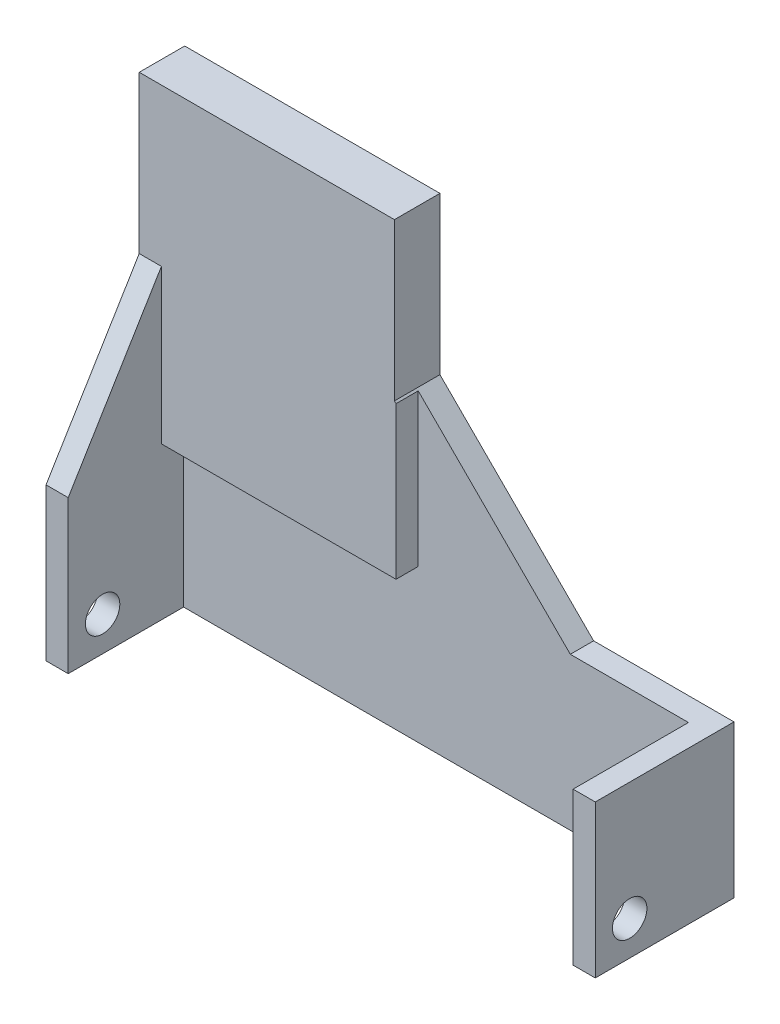
ISO-10303-21;
HEADER;
FILE_DESCRIPTION(('STEP AP214'),'2;1');
FILE_NAME('part.step','',(''),(''),'','','');
FILE_SCHEMA(('AUTOMOTIVE_DESIGN { 1 0 10303 214 1 1 1 1 }'));
ENDSEC;
DATA;
#1=APPLICATION_CONTEXT('core data for automotive mechanical design processes');
#2=APPLICATION_PROTOCOL_DEFINITION('international standard','automotive_design',2000,#1);
#3=PRODUCT_CONTEXT('',#1,'mechanical');
#4=PRODUCT('Part','Part','',(#3));
#5=PRODUCT_RELATED_PRODUCT_CATEGORY('part','',(#4));
#6=PRODUCT_DEFINITION_FORMATION('','',#4);
#7=PRODUCT_DEFINITION_CONTEXT('part definition',#1,'design');
#8=PRODUCT_DEFINITION('design','',#6,#7);
#9=PRODUCT_DEFINITION_SHAPE('','',#8);
#10=(LENGTH_UNIT() NAMED_UNIT(*) SI_UNIT(.MILLI.,.METRE.));
#11=(NAMED_UNIT(*) PLANE_ANGLE_UNIT() SI_UNIT($,.RADIAN.));
#12=(NAMED_UNIT(*) SI_UNIT($,.STERADIAN.) SOLID_ANGLE_UNIT());
#13=UNCERTAINTY_MEASURE_WITH_UNIT(LENGTH_MEASURE(1.E-05),#10,'distance_accuracy_value','');
#14=(GEOMETRIC_REPRESENTATION_CONTEXT(3) GLOBAL_UNCERTAINTY_ASSIGNED_CONTEXT((#13)) GLOBAL_UNIT_ASSIGNED_CONTEXT((#10,
#11,#12)) REPRESENTATION_CONTEXT('',''));
#15=CARTESIAN_POINT('',(0.,0.,0.));
#16=DIRECTION('',(0.,0.,1.));
#17=DIRECTION('',(1.,0.,0.));
#18=AXIS2_PLACEMENT_3D('',#15,#16,#17);
#19=CARTESIAN_POINT('',(-2.,41.74,0.));
#20=DIRECTION('',(0.,0.,-1.));
#21=DIRECTION('',(-1.,0.,0.));
#22=AXIS2_PLACEMENT_3D('',#19,#20,#21);
#23=PLANE('',#22);
#24=DIRECTION('',(0.,-1.,0.));
#25=VECTOR('',#24,1.);
#26=CARTESIAN_POINT('',(0.,41.74,0.));
#27=LINE('',#26,#25);
#28=CARTESIAN_POINT('',(0.,13.74,0.));
#29=VERTEX_POINT('',#28);
#30=CARTESIAN_POINT('',(0.,0.,0.));
#31=VERTEX_POINT('',#30);
#32=EDGE_CURVE('E46',#29,#31,#27,.T.);
#33=ORIENTED_EDGE('',*,*,#32,.F.);
#34=DIRECTION('',(-1.,0.,0.));
#35=VECTOR('',#34,1.);
#36=CARTESIAN_POINT('',(47.5,13.74,0.));
#37=LINE('',#36,#35);
#38=CARTESIAN_POINT('',(-2.,13.74,0.));
#39=VERTEX_POINT('',#38);
#40=EDGE_CURVE('E262',#29,#39,#37,.T.);
#41=ORIENTED_EDGE('',*,*,#40,.T.);
#42=DIRECTION('',(0.,-1.,0.));
#43=VECTOR('',#42,1.);
#44=CARTESIAN_POINT('',(-2.,41.74,0.));
#45=LINE('',#44,#43);
#46=CARTESIAN_POINT('',(-2.,0.,0.));
#47=VERTEX_POINT('',#46);
#48=EDGE_CURVE('E107',#39,#47,#45,.T.);
#49=ORIENTED_EDGE('',*,*,#48,.T.);
#50=DIRECTION('',(1.,0.,0.));
#51=VECTOR('',#50,1.);
#52=CARTESIAN_POINT('',(-2.,0.,0.));
#53=LINE('',#52,#51);
#54=EDGE_CURVE('E113',#47,#31,#53,.T.);
#55=ORIENTED_EDGE('',*,*,#54,.T.);
#56=EDGE_LOOP('',(#33,#41,#49,#55));
#57=FACE_BOUND('',#56,.T.);
#58=ADVANCED_FACE('F39',(#57),#23,.F.);
#59=CARTESIAN_POINT('',(0.,41.74,0.));
#60=DIRECTION('',(-1.,0.,0.));
#61=DIRECTION('',(0.,0.,1.));
#62=AXIS2_PLACEMENT_3D('',#59,#60,#61);
#63=PLANE('',#62);
#64=CARTESIAN_POINT('',(0.,3.1,-3.1));
#65=DIRECTION('',(-1.,0.,0.));
#66=DIRECTION('',(0.,0.,1.));
#67=AXIS2_PLACEMENT_3D('',#64,#65,#66);
#68=CIRCLE('',#67,1.55);
#69=CARTESIAN_POINT('',(0.,3.1,-1.55));
#70=VERTEX_POINT('',#69);
#71=EDGE_CURVE('E147',#70,#70,#68,.T.);
#72=ORIENTED_EDGE('',*,*,#71,.T.);
#73=EDGE_LOOP('',(#72));
#74=FACE_BOUND('',#73,.T.);
#75=DIRECTION('',(0.,-1.,0.));
#76=VECTOR('',#75,1.);
#77=CARTESIAN_POINT('',(0.,41.74,-8.4));
#78=LINE('',#77,#76);
#79=CARTESIAN_POINT('',(0.,27.59,-8.4));
#80=VERTEX_POINT('',#79);
#81=CARTESIAN_POINT('',(0.,13.74,-8.4));
#82=VERTEX_POINT('',#81);
#83=EDGE_CURVE('E126',#80,#82,#78,.T.);
#84=ORIENTED_EDGE('',*,*,#83,.F.);
#85=DIRECTION('',(0.,-0.8550319445017,0.518575330961319));
#86=VECTOR('',#85,1.);
#87=CARTESIAN_POINT('',(0.,34.210229531314,-12.4151572608691));
#88=LINE('',#87,#86);
#89=EDGE_CURVE('E139',#80,#29,#88,.T.);
#90=ORIENTED_EDGE('',*,*,#89,.T.);
#91=ORIENTED_EDGE('',*,*,#32,.T.);
#92=DIRECTION('',(0.,0.,-1.));
#93=VECTOR('',#92,1.);
#94=CARTESIAN_POINT('',(0.,0.,0.));
#95=LINE('',#94,#93);
#96=CARTESIAN_POINT('',(0.,0.,-10.4));
#97=VERTEX_POINT('',#96);
#98=EDGE_CURVE('E136',#31,#97,#95,.T.);
#99=ORIENTED_EDGE('',*,*,#98,.T.);
#100=DIRECTION('',(0.,-1.,0.));
#101=VECTOR('',#100,1.);
#102=CARTESIAN_POINT('',(0.,0.,-10.4));
#103=LINE('',#102,#101);
#104=CARTESIAN_POINT('',(0.,13.74,-10.4));
#105=VERTEX_POINT('',#104);
#106=EDGE_CURVE('E185',#105,#97,#103,.T.);
#107=ORIENTED_EDGE('',*,*,#106,.F.);
#108=DIRECTION('',(0.,0.,1.));
#109=VECTOR('',#108,1.);
#110=CARTESIAN_POINT('',(0.,13.74,-10.4));
#111=LINE('',#110,#109);
#112=EDGE_CURVE('E207',#105,#82,#111,.T.);
#113=ORIENTED_EDGE('',*,*,#112,.T.);
#114=EDGE_LOOP('',(#84,#90,#91,#99,#107,#113));
#115=FACE_BOUND('',#114,.T.);
#116=ADVANCED_FACE('F133',(#74,#115),#63,.F.);
#117=CARTESIAN_POINT('',(0.,41.74,-8.4));
#118=DIRECTION('',(0.,0.,-1.));
#119=DIRECTION('',(-1.,0.,0.));
#120=AXIS2_PLACEMENT_3D('',#117,#118,#119);
#121=PLANE('',#120);
#122=DIRECTION('',(-1.,0.,0.));
#123=VECTOR('',#122,1.);
#124=CARTESIAN_POINT('',(0.,13.74,-8.4));
#125=LINE('',#124,#123);
#126=CARTESIAN_POINT('',(21.1427104974823,13.74,-8.4));
#127=VERTEX_POINT('',#126);
#128=EDGE_CURVE('E199',#127,#82,#125,.T.);
#129=ORIENTED_EDGE('',*,*,#128,.F.);
#130=DIRECTION('',(0.,-1.,0.));
#131=VECTOR('',#130,1.);
#132=CARTESIAN_POINT('',(21.1427104974823,13.74,-8.4));
#133=LINE('',#132,#131);
#134=CARTESIAN_POINT('',(21.1427104974823,27.4472895025177,-8.4));
#135=VERTEX_POINT('',#134);
#136=EDGE_CURVE('E196',#135,#127,#133,.T.);
#137=ORIENTED_EDGE('',*,*,#136,.F.);
#138=DIRECTION('',(-0.707106781186546,0.707106781186549,0.));
#139=VECTOR('',#138,1.);
#140=CARTESIAN_POINT('',(3.42500000000005,45.165,-8.4));
#141=LINE('',#140,#139);
#142=CARTESIAN_POINT('',(21.,27.59,-8.4));
#143=VERTEX_POINT('',#142);
#144=EDGE_CURVE('E251',#135,#143,#141,.T.);
#145=ORIENTED_EDGE('',*,*,#144,.T.);
#146=DIRECTION('',(0.,1.,0.));
#147=VECTOR('',#146,1.);
#148=CARTESIAN_POINT('',(21.,41.74,-8.4));
#149=LINE('',#148,#147);
#150=CARTESIAN_POINT('',(21.,41.74,-8.4));
#151=VERTEX_POINT('',#150);
#152=EDGE_CURVE('E248',#143,#151,#149,.T.);
#153=ORIENTED_EDGE('',*,*,#152,.T.);
#154=DIRECTION('',(1.,0.,0.));
#155=VECTOR('',#154,1.);
#156=CARTESIAN_POINT('',(0.,41.74,-8.4));
#157=LINE('',#156,#155);
#158=CARTESIAN_POINT('',(-2.,41.74,-8.4));
#159=VERTEX_POINT('',#158);
#160=EDGE_CURVE('E114',#159,#151,#157,.T.);
#161=ORIENTED_EDGE('',*,*,#160,.F.);
#162=DIRECTION('',(0.,-1.,0.));
#163=VECTOR('',#162,1.);
#164=CARTESIAN_POINT('',(-2.,41.74,-8.4));
#165=LINE('',#164,#163);
#166=CARTESIAN_POINT('',(-2.,27.59,-8.4));
#167=VERTEX_POINT('',#166);
#168=EDGE_CURVE('E254',#159,#167,#165,.T.);
#169=ORIENTED_EDGE('',*,*,#168,.T.);
#170=DIRECTION('',(-1.,0.,0.));
#171=VECTOR('',#170,1.);
#172=CARTESIAN_POINT('',(47.5,27.59,-8.4));
#173=LINE('',#172,#171);
#174=EDGE_CURVE('E260',#80,#167,#173,.T.);
#175=ORIENTED_EDGE('',*,*,#174,.F.);
#176=ORIENTED_EDGE('',*,*,#83,.T.);
#177=EDGE_LOOP('',(#129,#137,#145,#153,#161,#169,#175,#176));
#178=FACE_BOUND('',#177,.T.);
#179=ADVANCED_FACE('F295',(#178),#121,.F.);
#180=CARTESIAN_POINT('',(45.5,41.74,-8.4));
#181=DIRECTION('',(1.,0.,0.));
#182=DIRECTION('',(0.,0.,-1.));
#183=AXIS2_PLACEMENT_3D('',#180,#181,#182);
#184=PLANE('',#183);
#185=CARTESIAN_POINT('',(45.5,3.1,-3.1));
#186=DIRECTION('',(1.,0.,0.));
#187=DIRECTION('',(0.,0.,-1.));
#188=AXIS2_PLACEMENT_3D('',#185,#186,#187);
#189=CIRCLE('',#188,1.55);
#190=CARTESIAN_POINT('',(45.5,3.1,-4.65));
#191=VERTEX_POINT('',#190);
#192=EDGE_CURVE('E150',#191,#191,#189,.T.);
#193=ORIENTED_EDGE('',*,*,#192,.T.);
#194=EDGE_LOOP('',(#193));
#195=FACE_BOUND('',#194,.T.);
#196=DIRECTION('',(0.,-1.,0.));
#197=VECTOR('',#196,1.);
#198=CARTESIAN_POINT('',(45.5,41.74,0.));
#199=LINE('',#198,#197);
#200=CARTESIAN_POINT('',(45.5,13.74,0.));
#201=VERTEX_POINT('',#200);
#202=CARTESIAN_POINT('',(45.5,0.,0.));
#203=VERTEX_POINT('',#202);
#204=EDGE_CURVE('E124',#201,#203,#199,.T.);
#205=ORIENTED_EDGE('',*,*,#204,.F.);
#206=DIRECTION('',(0.,0.,-1.));
#207=VECTOR('',#206,1.);
#208=CARTESIAN_POINT('',(45.5,13.74,-8.4));
#209=LINE('',#208,#207);
#210=CARTESIAN_POINT('',(45.5,13.74,-10.4));
#211=VERTEX_POINT('',#210);
#212=EDGE_CURVE('E53',#201,#211,#209,.T.);
#213=ORIENTED_EDGE('',*,*,#212,.T.);
#214=DIRECTION('',(0.,1.,0.));
#215=VECTOR('',#214,1.);
#216=CARTESIAN_POINT('',(45.5,13.74,-10.4));
#217=LINE('',#216,#215);
#218=CARTESIAN_POINT('',(45.5,0.,-10.4));
#219=VERTEX_POINT('',#218);
#220=EDGE_CURVE('E174',#219,#211,#217,.T.);
#221=ORIENTED_EDGE('',*,*,#220,.F.);
#222=DIRECTION('',(0.,0.,1.));
#223=VECTOR('',#222,1.);
#224=CARTESIAN_POINT('',(45.5,0.,-8.4));
#225=LINE('',#224,#223);
#226=EDGE_CURVE('E145',#219,#203,#225,.T.);
#227=ORIENTED_EDGE('',*,*,#226,.T.);
#228=EDGE_LOOP('',(#205,#213,#221,#227));
#229=FACE_BOUND('',#228,.T.);
#230=ADVANCED_FACE('F173',(#195,#229),#184,.F.);
#231=CARTESIAN_POINT('',(45.5,41.74,0.));
#232=DIRECTION('',(0.,0.,-1.));
#233=DIRECTION('',(-1.,0.,0.));
#234=AXIS2_PLACEMENT_3D('',#231,#232,#233);
#235=PLANE('',#234);
#236=DIRECTION('',(0.,-1.,0.));
#237=VECTOR('',#236,1.);
#238=CARTESIAN_POINT('',(47.5,41.74,0.));
#239=LINE('',#238,#237);
#240=CARTESIAN_POINT('',(47.5,13.74,0.));
#241=VERTEX_POINT('',#240);
#242=CARTESIAN_POINT('',(47.5,0.,0.));
#243=VERTEX_POINT('',#242);
#244=EDGE_CURVE('E122',#241,#243,#239,.T.);
#245=ORIENTED_EDGE('',*,*,#244,.F.);
#246=EDGE_CURVE('E172',#241,#201,#37,.T.);
#247=ORIENTED_EDGE('',*,*,#246,.T.);
#248=ORIENTED_EDGE('',*,*,#204,.T.);
#249=DIRECTION('',(1.,0.,0.));
#250=VECTOR('',#249,1.);
#251=CARTESIAN_POINT('',(45.5,0.,0.));
#252=LINE('',#251,#250);
#253=EDGE_CURVE('E157',#203,#243,#252,.T.);
#254=ORIENTED_EDGE('',*,*,#253,.T.);
#255=EDGE_LOOP('',(#245,#247,#248,#254));
#256=FACE_BOUND('',#255,.T.);
#257=ADVANCED_FACE('F167',(#256),#235,.F.);
#258=CARTESIAN_POINT('',(47.5,41.74,0.));
#259=DIRECTION('',(-1.,0.,0.));
#260=DIRECTION('',(0.,0.,1.));
#261=AXIS2_PLACEMENT_3D('',#258,#259,#260);
#262=PLANE('',#261);
#263=CARTESIAN_POINT('',(47.5,3.1,-3.1));
#264=DIRECTION('',(1.,0.,0.));
#265=DIRECTION('',(0.,0.,-1.));
#266=AXIS2_PLACEMENT_3D('',#263,#264,#265);
#267=CIRCLE('',#266,1.55);
#268=CARTESIAN_POINT('',(47.5,3.1,-4.65));
#269=VERTEX_POINT('',#268);
#270=EDGE_CURVE('E266',#269,#269,#267,.T.);
#271=ORIENTED_EDGE('',*,*,#270,.F.);
#272=EDGE_LOOP('',(#271));
#273=FACE_BOUND('',#272,.T.);
#274=DIRECTION('',(0.,-1.,0.));
#275=VECTOR('',#274,1.);
#276=CARTESIAN_POINT('',(47.5,41.74,-12.5));
#277=LINE('',#276,#275);
#278=CARTESIAN_POINT('',(47.5,13.74,-12.5));
#279=VERTEX_POINT('',#278);
#280=CARTESIAN_POINT('',(47.5,0.,-12.5));
#281=VERTEX_POINT('',#280);
#282=EDGE_CURVE('E92',#279,#281,#277,.T.);
#283=ORIENTED_EDGE('',*,*,#282,.F.);
#284=DIRECTION('',(0.,0.,-1.));
#285=VECTOR('',#284,1.);
#286=CARTESIAN_POINT('',(47.5,13.74,0.));
#287=LINE('',#286,#285);
#288=EDGE_CURVE('E238',#241,#279,#287,.T.);
#289=ORIENTED_EDGE('',*,*,#288,.F.);
#290=ORIENTED_EDGE('',*,*,#244,.T.);
#291=DIRECTION('',(0.,0.,-1.));
#292=VECTOR('',#291,1.);
#293=CARTESIAN_POINT('',(47.5,0.,0.));
#294=LINE('',#293,#292);
#295=EDGE_CURVE('E98',#243,#281,#294,.T.);
#296=ORIENTED_EDGE('',*,*,#295,.T.);
#297=EDGE_LOOP('',(#283,#289,#290,#296));
#298=FACE_BOUND('',#297,.T.);
#299=ADVANCED_FACE('F160',(#273,#298),#262,.F.);
#300=CARTESIAN_POINT('',(47.5,41.74,-12.5));
#301=DIRECTION('',(0.,0.,1.));
#302=DIRECTION('',(1.,0.,0.));
#303=AXIS2_PLACEMENT_3D('',#300,#301,#302);
#304=PLANE('',#303);
#305=CARTESIAN_POINT('',(2.99999999999999,21.74,-12.5));
#306=DIRECTION('',(0.,0.,-1.));
#307=DIRECTION('',(-1.,0.,0.));
#308=AXIS2_PLACEMENT_3D('',#305,#306,#307);
#309=CIRCLE('',#308,2.25);
#310=CARTESIAN_POINT('',(0.749999999999996,21.74,-12.5));
#311=VERTEX_POINT('',#310);
#312=EDGE_CURVE('E216',#311,#311,#309,.T.);
#313=ORIENTED_EDGE('',*,*,#312,.F.);
#314=EDGE_LOOP('',(#313));
#315=FACE_BOUND('',#314,.T.);
#316=CARTESIAN_POINT('',(10.5,27.74,-12.5));
#317=DIRECTION('',(0.,0.,-1.));
#318=DIRECTION('',(-1.,0.,0.));
#319=AXIS2_PLACEMENT_3D('',#316,#317,#318);
#320=CIRCLE('',#319,2.25);
#321=CARTESIAN_POINT('',(8.24999999999999,27.74,-12.5));
#322=VERTEX_POINT('',#321);
#323=EDGE_CURVE('E219',#322,#322,#320,.T.);
#324=ORIENTED_EDGE('',*,*,#323,.F.);
#325=EDGE_LOOP('',(#324));
#326=FACE_BOUND('',#325,.T.);
#327=CARTESIAN_POINT('',(2.99999999999999,33.74,-12.5));
#328=DIRECTION('',(0.,0.,-1.));
#329=DIRECTION('',(-1.,0.,0.));
#330=AXIS2_PLACEMENT_3D('',#327,#328,#329);
#331=CIRCLE('',#330,2.25);
#332=CARTESIAN_POINT('',(0.749999999999994,33.74,-12.5));
#333=VERTEX_POINT('',#332);
#334=EDGE_CURVE('E225',#333,#333,#331,.T.);
#335=ORIENTED_EDGE('',*,*,#334,.F.);
#336=EDGE_LOOP('',(#335));
#337=FACE_BOUND('',#336,.T.);
#338=DIRECTION('',(-1.,0.,0.));
#339=VECTOR('',#338,1.);
#340=CARTESIAN_POINT('',(47.5,41.74,-12.5));
#341=LINE('',#340,#339);
#342=CARTESIAN_POINT('',(21.,41.74,-12.5));
#343=VERTEX_POINT('',#342);
#344=CARTESIAN_POINT('',(-2.,41.74,-12.5));
#345=VERTEX_POINT('',#344);
#346=EDGE_CURVE('E62',#343,#345,#341,.T.);
#347=ORIENTED_EDGE('',*,*,#346,.F.);
#348=DIRECTION('',(0.,1.,0.));
#349=VECTOR('',#348,1.);
#350=CARTESIAN_POINT('',(21.,41.74,-12.5));
#351=LINE('',#350,#349);
#352=CARTESIAN_POINT('',(21.,27.59,-12.5));
#353=VERTEX_POINT('',#352);
#354=EDGE_CURVE('E235',#353,#343,#351,.T.);
#355=ORIENTED_EDGE('',*,*,#354,.F.);
#356=DIRECTION('',(-0.707106781186546,0.707106781186549,0.));
#357=VECTOR('',#356,1.);
#358=CARTESIAN_POINT('',(21.,27.59,-12.5));
#359=LINE('',#358,#357);
#360=CARTESIAN_POINT('',(34.85,13.74,-12.5));
#361=VERTEX_POINT('',#360);
#362=EDGE_CURVE('E232',#361,#353,#359,.T.);
#363=ORIENTED_EDGE('',*,*,#362,.F.);
#364=DIRECTION('',(-1.,0.,0.));
#365=VECTOR('',#364,1.);
#366=CARTESIAN_POINT('',(34.85,13.74,-12.5));
#367=LINE('',#366,#365);
#368=EDGE_CURVE('E215',#279,#361,#367,.T.);
#369=ORIENTED_EDGE('',*,*,#368,.F.);
#370=ORIENTED_EDGE('',*,*,#282,.T.);
#371=DIRECTION('',(-1.,0.,0.));
#372=VECTOR('',#371,1.);
#373=CARTESIAN_POINT('',(47.5,0.,-12.5));
#374=LINE('',#373,#372);
#375=CARTESIAN_POINT('',(-2.,0.,-12.5));
#376=VERTEX_POINT('',#375);
#377=EDGE_CURVE('E85',#281,#376,#374,.T.);
#378=ORIENTED_EDGE('',*,*,#377,.T.);
#379=DIRECTION('',(0.,-1.,0.));
#380=VECTOR('',#379,1.);
#381=CARTESIAN_POINT('',(-2.,41.74,-12.5));
#382=LINE('',#381,#380);
#383=EDGE_CURVE('E88',#345,#376,#382,.T.);
#384=ORIENTED_EDGE('',*,*,#383,.F.);
#385=EDGE_LOOP('',(#347,#355,#363,#369,#370,#378,#384));
#386=FACE_BOUND('',#385,.T.);
#387=ADVANCED_FACE('F87',(#315,#326,#337,#386),#304,.F.);
#388=CARTESIAN_POINT('',(-2.,41.74,-12.5));
#389=DIRECTION('',(1.,0.,0.));
#390=DIRECTION('',(0.,0.,-1.));
#391=AXIS2_PLACEMENT_3D('',#388,#389,#390);
#392=PLANE('',#391);
#393=CARTESIAN_POINT('',(-2.,3.1,-3.1));
#394=DIRECTION('',(1.,0.,0.));
#395=DIRECTION('',(0.,0.,-1.));
#396=AXIS2_PLACEMENT_3D('',#393,#394,#395);
#397=CIRCLE('',#396,1.55);
#398=CARTESIAN_POINT('',(-2.,3.1,-4.65));
#399=VERTEX_POINT('',#398);
#400=EDGE_CURVE('E267',#399,#399,#397,.T.);
#401=ORIENTED_EDGE('',*,*,#400,.T.);
#402=EDGE_LOOP('',(#401));
#403=FACE_BOUND('',#402,.T.);
#404=ORIENTED_EDGE('',*,*,#48,.F.);
#405=DIRECTION('',(0.,-0.8550319445017,0.518575330961319));
#406=VECTOR('',#405,1.);
#407=CARTESIAN_POINT('',(-2.,27.59,-8.4));
#408=LINE('',#407,#406);
#409=EDGE_CURVE('E257',#167,#39,#408,.T.);
#410=ORIENTED_EDGE('',*,*,#409,.F.);
#411=ORIENTED_EDGE('',*,*,#168,.F.);
#412=DIRECTION('',(0.,0.,1.));
#413=VECTOR('',#412,1.);
#414=CARTESIAN_POINT('',(-2.,41.74,-12.5));
#415=LINE('',#414,#413);
#416=EDGE_CURVE('E106',#345,#159,#415,.T.);
#417=ORIENTED_EDGE('',*,*,#416,.F.);
#418=ORIENTED_EDGE('',*,*,#383,.T.);
#419=DIRECTION('',(0.,0.,1.));
#420=VECTOR('',#419,1.);
#421=CARTESIAN_POINT('',(-2.,0.,-12.5));
#422=LINE('',#421,#420);
#423=EDGE_CURVE('E97',#376,#47,#422,.T.);
#424=ORIENTED_EDGE('',*,*,#423,.T.);
#425=EDGE_LOOP('',(#404,#410,#411,#417,#418,#424));
#426=FACE_BOUND('',#425,.T.);
#427=ADVANCED_FACE('F103',(#403,#426),#392,.F.);
#428=CARTESIAN_POINT('',(0.,41.74,0.));
#429=DIRECTION('',(0.,1.,0.));
#430=DIRECTION('',(0.,0.,1.));
#431=AXIS2_PLACEMENT_3D('',#428,#429,#430);
#432=PLANE('',#431);
#433=DIRECTION('',(0.,0.,1.));
#434=VECTOR('',#433,1.);
#435=CARTESIAN_POINT('',(21.,41.74,0.));
#436=LINE('',#435,#434);
#437=EDGE_CURVE('E11',#343,#151,#436,.T.);
#438=ORIENTED_EDGE('',*,*,#437,.F.);
#439=ORIENTED_EDGE('',*,*,#346,.T.);
#440=ORIENTED_EDGE('',*,*,#416,.T.);
#441=ORIENTED_EDGE('',*,*,#160,.T.);
#442=EDGE_LOOP('',(#438,#439,#440,#441));
#443=FACE_BOUND('',#442,.T.);
#444=ADVANCED_FACE('F274',(#443),#432,.T.);
#445=CARTESIAN_POINT('',(0.,0.,0.));
#446=DIRECTION('',(0.,1.,0.));
#447=DIRECTION('',(0.,0.,1.));
#448=AXIS2_PLACEMENT_3D('',#445,#446,#447);
#449=PLANE('',#448);
#450=ORIENTED_EDGE('',*,*,#226,.F.);
#451=DIRECTION('',(1.,0.,0.));
#452=VECTOR('',#451,1.);
#453=CARTESIAN_POINT('',(45.5,0.,-10.4));
#454=LINE('',#453,#452);
#455=EDGE_CURVE('E144',#97,#219,#454,.T.);
#456=ORIENTED_EDGE('',*,*,#455,.F.);
#457=ORIENTED_EDGE('',*,*,#98,.F.);
#458=ORIENTED_EDGE('',*,*,#54,.F.);
#459=ORIENTED_EDGE('',*,*,#423,.F.);
#460=ORIENTED_EDGE('',*,*,#377,.F.);
#461=ORIENTED_EDGE('',*,*,#295,.F.);
#462=ORIENTED_EDGE('',*,*,#253,.F.);
#463=EDGE_LOOP('',(#450,#456,#457,#458,#459,#460,#461,#462));
#464=FACE_BOUND('',#463,.T.);
#465=ADVANCED_FACE('F110',(#464),#449,.F.);
#466=CARTESIAN_POINT('',(-2.,3.1,-3.1));
#467=DIRECTION('',(1.,0.,0.));
#468=DIRECTION('',(0.,0.,-1.));
#469=AXIS2_PLACEMENT_3D('',#466,#467,#468);
#470=CYLINDRICAL_SURFACE('',#469,1.55);
#471=ORIENTED_EDGE('',*,*,#400,.F.);
#472=EDGE_LOOP('',(#471));
#473=FACE_BOUND('',#472,.T.);
#474=ORIENTED_EDGE('',*,*,#71,.F.);
#475=EDGE_LOOP('',(#474));
#476=FACE_BOUND('',#475,.T.);
#477=ADVANCED_FACE('F380',(#473,#476),#470,.F.);
#478=ORIENTED_EDGE('',*,*,#270,.T.);
#479=EDGE_LOOP('',(#478));
#480=FACE_BOUND('',#479,.T.);
#481=ORIENTED_EDGE('',*,*,#192,.F.);
#482=EDGE_LOOP('',(#481));
#483=FACE_BOUND('',#482,.T.);
#484=ADVANCED_FACE('F385',(#480,#483),#470,.F.);
#485=CARTESIAN_POINT('',(47.5,27.59,-8.4));
#486=DIRECTION('',(0.,-0.518575330961319,-0.8550319445017));
#487=DIRECTION('',(0.,0.8550319445017,-0.518575330961319));
#488=AXIS2_PLACEMENT_3D('',#485,#486,#487);
#489=PLANE('',#488);
#490=ORIENTED_EDGE('',*,*,#174,.T.);
#491=ORIENTED_EDGE('',*,*,#409,.T.);
#492=ORIENTED_EDGE('',*,*,#40,.F.);
#493=ORIENTED_EDGE('',*,*,#89,.F.);
#494=EDGE_LOOP('',(#490,#491,#492,#493));
#495=FACE_BOUND('',#494,.T.);
#496=ADVANCED_FACE('F291',(#495),#489,.F.);
#497=CARTESIAN_POINT('',(21.,27.59,0.));
#498=DIRECTION('',(-0.707106781186549,-0.707106781186546,0.));
#499=DIRECTION('',(0.707106781186546,-0.707106781186549,0.));
#500=AXIS2_PLACEMENT_3D('',#497,#498,#499);
#501=PLANE('',#500);
#502=ORIENTED_EDGE('',*,*,#144,.F.);
#503=DIRECTION('',(0.,0.,1.));
#504=VECTOR('',#503,1.);
#505=CARTESIAN_POINT('',(21.1427104974823,27.4472895025177,-10.4));
#506=LINE('',#505,#504);
#507=CARTESIAN_POINT('',(21.1427104974823,27.4472895025177,-10.4));
#508=VERTEX_POINT('',#507);
#509=EDGE_CURVE('E203',#508,#135,#506,.T.);
#510=ORIENTED_EDGE('',*,*,#509,.F.);
#511=DIRECTION('',(-0.707106781186546,0.707106781186549,0.));
#512=VECTOR('',#511,1.);
#513=CARTESIAN_POINT('',(21.1427104974823,27.4472895025177,-10.4));
#514=LINE('',#513,#512);
#515=CARTESIAN_POINT('',(34.85,13.74,-10.4));
#516=VERTEX_POINT('',#515);
#517=EDGE_CURVE('E192',#516,#508,#514,.T.);
#518=ORIENTED_EDGE('',*,*,#517,.F.);
#519=DIRECTION('',(0.,0.,-1.));
#520=VECTOR('',#519,1.);
#521=CARTESIAN_POINT('',(34.85,13.74,0.));
#522=LINE('',#521,#520);
#523=EDGE_CURVE('E242',#516,#361,#522,.T.);
#524=ORIENTED_EDGE('',*,*,#523,.T.);
#525=ORIENTED_EDGE('',*,*,#362,.T.);
#526=DIRECTION('',(0.,0.,-1.));
#527=VECTOR('',#526,1.);
#528=CARTESIAN_POINT('',(21.,27.59,0.));
#529=LINE('',#528,#527);
#530=EDGE_CURVE('E239',#143,#353,#529,.T.);
#531=ORIENTED_EDGE('',*,*,#530,.F.);
#532=EDGE_LOOP('',(#502,#510,#518,#524,#525,#531));
#533=FACE_BOUND('',#532,.T.);
#534=ADVANCED_FACE('F328',(#533),#501,.F.);
#535=CARTESIAN_POINT('',(21.,41.74,0.));
#536=DIRECTION('',(-1.,0.,0.));
#537=DIRECTION('',(0.,0.,1.));
#538=AXIS2_PLACEMENT_3D('',#535,#536,#537);
#539=PLANE('',#538);
#540=ORIENTED_EDGE('',*,*,#530,.T.);
#541=ORIENTED_EDGE('',*,*,#354,.T.);
#542=ORIENTED_EDGE('',*,*,#437,.T.);
#543=ORIENTED_EDGE('',*,*,#152,.F.);
#544=EDGE_LOOP('',(#540,#541,#542,#543));
#545=FACE_BOUND('',#544,.T.);
#546=ADVANCED_FACE('F327',(#545),#539,.F.);
#547=CARTESIAN_POINT('',(34.85,13.74,0.));
#548=DIRECTION('',(0.,-1.,0.));
#549=DIRECTION('',(1.,0.,0.));
#550=AXIS2_PLACEMENT_3D('',#547,#548,#549);
#551=PLANE('',#550);
#552=DIRECTION('',(-1.,0.,0.));
#553=VECTOR('',#552,1.);
#554=CARTESIAN_POINT('',(34.85,13.74,-10.4));
#555=LINE('',#554,#553);
#556=EDGE_CURVE('E180',#211,#516,#555,.T.);
#557=ORIENTED_EDGE('',*,*,#556,.F.);
#558=ORIENTED_EDGE('',*,*,#212,.F.);
#559=ORIENTED_EDGE('',*,*,#246,.F.);
#560=ORIENTED_EDGE('',*,*,#288,.T.);
#561=ORIENTED_EDGE('',*,*,#368,.T.);
#562=ORIENTED_EDGE('',*,*,#523,.F.);
#563=EDGE_LOOP('',(#557,#558,#559,#560,#561,#562));
#564=FACE_BOUND('',#563,.T.);
#565=ADVANCED_FACE('F333',(#564),#551,.F.);
#566=CARTESIAN_POINT('',(3.,33.74,-9.4));
#567=DIRECTION('',(0.,0.,-1.));
#568=DIRECTION('',(-1.,0.,0.));
#569=AXIS2_PLACEMENT_3D('',#566,#567,#568);
#570=CYLINDRICAL_SURFACE('',#569,2.25);
#571=CARTESIAN_POINT('',(3.,33.74,-9.4));
#572=DIRECTION('',(0.,0.,-1.));
#573=DIRECTION('',(-1.,0.,0.));
#574=AXIS2_PLACEMENT_3D('',#571,#572,#573);
#575=CIRCLE('',#574,2.25);
#576=CARTESIAN_POINT('',(0.749999999999995,33.74,-9.4));
#577=VERTEX_POINT('',#576);
#578=EDGE_CURVE('E206',#577,#577,#575,.T.);
#579=CARTESIAN_POINT('',(0.749999999999995,33.74,-9.4));
#580=CARTESIAN_POINT('',(0.749999999999995,33.74,-9.43229166666667));
#581=CARTESIAN_POINT('',(0.749999999999995,33.74,-9.46458333333333));
#582=CARTESIAN_POINT('',(0.749999999999995,33.74,-9.52916666666667));
#583=CARTESIAN_POINT('',(0.749999999999995,33.74,-9.56145833333333));
#584=CARTESIAN_POINT('',(0.749999999999995,33.74,-9.62604166666667));
#585=CARTESIAN_POINT('',(0.749999999999995,33.74,-9.65833333333333));
#586=CARTESIAN_POINT('',(0.749999999999995,33.74,-9.72291666666667));
#587=CARTESIAN_POINT('',(0.749999999999995,33.74,-9.75520833333333));
#588=CARTESIAN_POINT('',(0.749999999999995,33.74,-9.81979166666667));
#589=CARTESIAN_POINT('',(0.749999999999995,33.74,-9.85208333333333));
#590=CARTESIAN_POINT('',(0.749999999999995,33.74,-9.91666666666667));
#591=CARTESIAN_POINT('',(0.749999999999994,33.74,-9.94895833333333));
#592=CARTESIAN_POINT('',(0.749999999999994,33.74,-10.0135416666667));
#593=CARTESIAN_POINT('',(0.749999999999994,33.74,-10.0458333333333));
#594=CARTESIAN_POINT('',(0.749999999999994,33.74,-10.1104166666667));
#595=CARTESIAN_POINT('',(0.749999999999994,33.74,-10.1427083333333));
#596=CARTESIAN_POINT('',(0.749999999999994,33.74,-10.2072916666667));
#597=CARTESIAN_POINT('',(0.749999999999994,33.74,-10.2395833333333));
#598=CARTESIAN_POINT('',(0.749999999999994,33.74,-10.3041666666667));
#599=CARTESIAN_POINT('',(0.749999999999994,33.74,-10.3364583333333));
#600=CARTESIAN_POINT('',(0.749999999999994,33.74,-10.4010416666667));
#601=CARTESIAN_POINT('',(0.749999999999994,33.74,-10.4333333333333));
#602=CARTESIAN_POINT('',(0.749999999999994,33.74,-10.4979166666667));
#603=CARTESIAN_POINT('',(0.749999999999994,33.74,-10.5302083333333));
#604=CARTESIAN_POINT('',(0.749999999999994,33.74,-10.5947916666667));
#605=CARTESIAN_POINT('',(0.749999999999994,33.74,-10.6270833333333));
#606=CARTESIAN_POINT('',(0.749999999999994,33.74,-10.6916666666667));
#607=CARTESIAN_POINT('',(0.749999999999994,33.74,-10.7239583333333));
#608=CARTESIAN_POINT('',(0.749999999999994,33.74,-10.7885416666667));
#609=CARTESIAN_POINT('',(0.749999999999994,33.74,-10.8208333333333));
#610=CARTESIAN_POINT('',(0.749999999999994,33.74,-10.8854166666667));
#611=CARTESIAN_POINT('',(0.749999999999994,33.74,-10.9177083333333));
#612=CARTESIAN_POINT('',(0.749999999999994,33.74,-10.9822916666667));
#613=CARTESIAN_POINT('',(0.749999999999994,33.74,-11.0145833333333));
#614=CARTESIAN_POINT('',(0.749999999999994,33.74,-11.0791666666667));
#615=CARTESIAN_POINT('',(0.749999999999994,33.74,-11.1114583333333));
#616=CARTESIAN_POINT('',(0.749999999999994,33.74,-11.1760416666667));
#617=CARTESIAN_POINT('',(0.749999999999994,33.74,-11.2083333333333));
#618=CARTESIAN_POINT('',(0.749999999999994,33.74,-11.2729166666667));
#619=CARTESIAN_POINT('',(0.749999999999994,33.74,-11.3052083333333));
#620=CARTESIAN_POINT('',(0.749999999999994,33.74,-11.3697916666667));
#621=CARTESIAN_POINT('',(0.749999999999994,33.74,-11.4020833333333));
#622=CARTESIAN_POINT('',(0.749999999999994,33.74,-11.4666666666667));
#623=CARTESIAN_POINT('',(0.749999999999994,33.74,-11.4989583333333));
#624=CARTESIAN_POINT('',(0.749999999999994,33.74,-11.5635416666667));
#625=CARTESIAN_POINT('',(0.749999999999994,33.74,-11.5958333333333));
#626=CARTESIAN_POINT('',(0.749999999999994,33.74,-11.6604166666667));
#627=CARTESIAN_POINT('',(0.749999999999994,33.74,-11.6927083333333));
#628=CARTESIAN_POINT('',(0.749999999999994,33.74,-11.7572916666667));
#629=CARTESIAN_POINT('',(0.749999999999994,33.74,-11.7895833333333));
#630=CARTESIAN_POINT('',(0.749999999999994,33.74,-11.8541666666667));
#631=CARTESIAN_POINT('',(0.749999999999994,33.74,-11.8864583333333));
#632=CARTESIAN_POINT('',(0.749999999999994,33.74,-11.9510416666667));
#633=CARTESIAN_POINT('',(0.749999999999994,33.74,-11.9833333333333));
#634=CARTESIAN_POINT('',(0.749999999999994,33.74,-12.0479166666667));
#635=CARTESIAN_POINT('',(0.749999999999994,33.74,-12.0802083333333));
#636=CARTESIAN_POINT('',(0.749999999999994,33.74,-12.1447916666667));
#637=CARTESIAN_POINT('',(0.749999999999994,33.74,-12.1770833333333));
#638=CARTESIAN_POINT('',(0.749999999999994,33.74,-12.2416666666667));
#639=CARTESIAN_POINT('',(0.749999999999994,33.74,-12.2739583333333));
#640=CARTESIAN_POINT('',(0.749999999999994,33.74,-12.3385416666667));
#641=CARTESIAN_POINT('',(0.749999999999994,33.74,-12.3708333333333));
#642=CARTESIAN_POINT('',(0.749999999999994,33.74,-12.4354166666667));
#643=CARTESIAN_POINT('',(0.749999999999994,33.74,-12.4677083333333));
#644=CARTESIAN_POINT('',(0.749999999999994,33.74,-12.5));
#645=B_SPLINE_CURVE_WITH_KNOTS('',3,(#579,#580,#581,#582,#583,#584,#585,#586,#587,#588,#589,
#590,#591,#592,#593,#594,#595,#596,#597,#598,#599,#600,#601,#602,#603,#604,#605,#606,#607,#608,
#609,#610,#611,#612,#613,#614,#615,#616,#617,#618,#619,#620,#621,#622,#623,#624,#625,#626,#627,
#628,#629,#630,#631,#632,#633,#634,#635,#636,#637,#638,#639,#640,#641,#642,#643,#644),
.UNSPECIFIED.,.F.,.F.,(4,2,2,2,2,2,2,2,2,2,2,2,2,2,2,2,2,2,2,2,2,2,2,2,2,2,2,2,2,2,2,2,4),(0.,
0.0968749999999997,0.193749999999999,0.290624999999999,0.387499999999999,0.484374999999999,
0.581249999999998,0.678125,0.775,0.871874999999999,0.968749999999999,1.065625,1.1625,1.259375,
1.35625,1.453125,1.55,1.646875,1.74375,1.840625,1.9375,2.034375,2.13125,2.228125,2.325,2.421875,
2.51875,2.615625,2.7125,2.809375,2.90625,3.003125,3.1),.UNSPECIFIED.);
#646=EDGE_CURVE('BSEAM390',#577,#333,#645,.T.);
#647=ORIENTED_EDGE('',*,*,#578,.F.);
#648=ORIENTED_EDGE('',*,*,#334,.T.);
#649=ORIENTED_EDGE('',*,*,#646,.T.);
#650=ORIENTED_EDGE('',*,*,#646,.F.);
#651=EDGE_LOOP('',(#647,#649,#648,#650));
#652=FACE_BOUND('',#651,.T.);
#653=ADVANCED_FACE('F390',(#652),#570,.F.);
#654=CARTESIAN_POINT('',(3.,33.74,-9.4));
#655=DIRECTION('',(0.,0.,-1.));
#656=DIRECTION('',(-1.,0.,0.));
#657=AXIS2_PLACEMENT_3D('',#654,#655,#656);
#658=PLANE('',#657);
#659=ORIENTED_EDGE('',*,*,#578,.T.);
#660=EDGE_LOOP('',(#659));
#661=FACE_BOUND('',#660,.T.);
#662=ADVANCED_FACE('F395',(#661),#658,.T.);
#663=CARTESIAN_POINT('',(10.5,27.74,-9.4));
#664=DIRECTION('',(0.,0.,-1.));
#665=DIRECTION('',(-1.,0.,0.));
#666=AXIS2_PLACEMENT_3D('',#663,#664,#665);
#667=CYLINDRICAL_SURFACE('',#666,2.25);
#668=CARTESIAN_POINT('',(10.5,27.74,-9.4));
#669=DIRECTION('',(0.,0.,-1.));
#670=DIRECTION('',(-1.,0.,0.));
#671=AXIS2_PLACEMENT_3D('',#668,#669,#670);
#672=CIRCLE('',#671,2.25);
#673=CARTESIAN_POINT('',(8.24999999999999,27.74,-9.4));
#674=VERTEX_POINT('',#673);
#675=EDGE_CURVE('E222',#674,#674,#672,.T.);
#676=CARTESIAN_POINT('',(8.24999999999999,27.74,-9.4));
#677=CARTESIAN_POINT('',(8.24999999999999,27.74,-9.43229166666667));
#678=CARTESIAN_POINT('',(8.24999999999999,27.74,-9.46458333333334));
#679=CARTESIAN_POINT('',(8.24999999999999,27.74,-9.52916666666667));
#680=CARTESIAN_POINT('',(8.24999999999999,27.74,-9.56145833333333));
#681=CARTESIAN_POINT('',(8.24999999999999,27.74,-9.62604166666667));
#682=CARTESIAN_POINT('',(8.24999999999999,27.74,-9.65833333333333));
#683=CARTESIAN_POINT('',(8.24999999999999,27.74,-9.72291666666667));
#684=CARTESIAN_POINT('',(8.24999999999999,27.74,-9.75520833333333));
#685=CARTESIAN_POINT('',(8.24999999999999,27.74,-9.81979166666667));
#686=CARTESIAN_POINT('',(8.24999999999999,27.74,-9.85208333333333));
#687=CARTESIAN_POINT('',(8.24999999999999,27.74,-9.91666666666667));
#688=CARTESIAN_POINT('',(8.24999999999999,27.74,-9.94895833333333));
#689=CARTESIAN_POINT('',(8.24999999999999,27.74,-10.0135416666667));
#690=CARTESIAN_POINT('',(8.24999999999999,27.74,-10.0458333333333));
#691=CARTESIAN_POINT('',(8.24999999999999,27.74,-10.1104166666667));
#692=CARTESIAN_POINT('',(8.24999999999999,27.74,-10.1427083333333));
#693=CARTESIAN_POINT('',(8.24999999999999,27.74,-10.2072916666667));
#694=CARTESIAN_POINT('',(8.24999999999999,27.74,-10.2395833333333));
#695=CARTESIAN_POINT('',(8.24999999999999,27.74,-10.3041666666667));
#696=CARTESIAN_POINT('',(8.24999999999999,27.74,-10.3364583333333));
#697=CARTESIAN_POINT('',(8.24999999999999,27.74,-10.4010416666667));
#698=CARTESIAN_POINT('',(8.24999999999999,27.74,-10.4333333333333));
#699=CARTESIAN_POINT('',(8.24999999999999,27.74,-10.4979166666667));
#700=CARTESIAN_POINT('',(8.24999999999999,27.74,-10.5302083333333));
#701=CARTESIAN_POINT('',(8.24999999999999,27.74,-10.5947916666667));
#702=CARTESIAN_POINT('',(8.24999999999999,27.74,-10.6270833333333));
#703=CARTESIAN_POINT('',(8.24999999999999,27.74,-10.6916666666667));
#704=CARTESIAN_POINT('',(8.24999999999999,27.74,-10.7239583333333));
#705=CARTESIAN_POINT('',(8.24999999999999,27.74,-10.7885416666667));
#706=CARTESIAN_POINT('',(8.24999999999999,27.74,-10.8208333333333));
#707=CARTESIAN_POINT('',(8.24999999999999,27.74,-10.8854166666667));
#708=CARTESIAN_POINT('',(8.24999999999999,27.74,-10.9177083333333));
#709=CARTESIAN_POINT('',(8.24999999999999,27.74,-10.9822916666667));
#710=CARTESIAN_POINT('',(8.24999999999999,27.74,-11.0145833333333));
#711=CARTESIAN_POINT('',(8.24999999999999,27.74,-11.0791666666667));
#712=CARTESIAN_POINT('',(8.24999999999999,27.74,-11.1114583333333));
#713=CARTESIAN_POINT('',(8.24999999999999,27.74,-11.1760416666667));
#714=CARTESIAN_POINT('',(8.24999999999999,27.74,-11.2083333333333));
#715=CARTESIAN_POINT('',(8.24999999999999,27.74,-11.2729166666667));
#716=CARTESIAN_POINT('',(8.24999999999999,27.74,-11.3052083333333));
#717=CARTESIAN_POINT('',(8.24999999999999,27.74,-11.3697916666667));
#718=CARTESIAN_POINT('',(8.24999999999999,27.74,-11.4020833333333));
#719=CARTESIAN_POINT('',(8.24999999999999,27.74,-11.4666666666667));
#720=CARTESIAN_POINT('',(8.24999999999999,27.74,-11.4989583333333));
#721=CARTESIAN_POINT('',(8.24999999999999,27.74,-11.5635416666667));
#722=CARTESIAN_POINT('',(8.24999999999999,27.74,-11.5958333333333));
#723=CARTESIAN_POINT('',(8.24999999999999,27.74,-11.6604166666667));
#724=CARTESIAN_POINT('',(8.24999999999999,27.74,-11.6927083333333));
#725=CARTESIAN_POINT('',(8.24999999999999,27.74,-11.7572916666667));
#726=CARTESIAN_POINT('',(8.24999999999999,27.74,-11.7895833333333));
#727=CARTESIAN_POINT('',(8.24999999999999,27.74,-11.8541666666667));
#728=CARTESIAN_POINT('',(8.24999999999999,27.74,-11.8864583333333));
#729=CARTESIAN_POINT('',(8.24999999999999,27.74,-11.9510416666667));
#730=CARTESIAN_POINT('',(8.24999999999999,27.74,-11.9833333333333));
#731=CARTESIAN_POINT('',(8.24999999999999,27.74,-12.0479166666667));
#732=CARTESIAN_POINT('',(8.24999999999999,27.74,-12.0802083333333));
#733=CARTESIAN_POINT('',(8.24999999999999,27.74,-12.1447916666667));
#734=CARTESIAN_POINT('',(8.24999999999999,27.74,-12.1770833333333));
#735=CARTESIAN_POINT('',(8.24999999999999,27.74,-12.2416666666667));
#736=CARTESIAN_POINT('',(8.24999999999999,27.74,-12.2739583333333));
#737=CARTESIAN_POINT('',(8.24999999999999,27.74,-12.3385416666667));
#738=CARTESIAN_POINT('',(8.24999999999999,27.74,-12.3708333333333));
#739=CARTESIAN_POINT('',(8.24999999999999,27.74,-12.4354166666667));
#740=CARTESIAN_POINT('',(8.24999999999999,27.74,-12.4677083333333));
#741=CARTESIAN_POINT('',(8.24999999999999,27.74,-12.5));
#742=B_SPLINE_CURVE_WITH_KNOTS('',3,(#676,#677,#678,#679,#680,#681,#682,#683,#684,#685,#686,
#687,#688,#689,#690,#691,#692,#693,#694,#695,#696,#697,#698,#699,#700,#701,#702,#703,#704,#705,
#706,#707,#708,#709,#710,#711,#712,#713,#714,#715,#716,#717,#718,#719,#720,#721,#722,#723,#724,
#725,#726,#727,#728,#729,#730,#731,#732,#733,#734,#735,#736,#737,#738,#739,#740,#741),
.UNSPECIFIED.,.F.,.F.,(4,2,2,2,2,2,2,2,2,2,2,2,2,2,2,2,2,2,2,2,2,2,2,2,2,2,2,2,2,2,2,2,4),(0.,
0.0968749999999997,0.193749999999999,0.290624999999999,0.387499999999999,0.484374999999999,
0.581249999999998,0.678125,0.775,0.871874999999999,0.968749999999999,1.065625,1.1625,1.259375,
1.35625,1.453125,1.55,1.646875,1.74375,1.840625,1.9375,2.034375,2.13125,2.228125,2.325,2.421875,
2.51875,2.615625,2.7125,2.809375,2.90625,3.003125,3.1),.UNSPECIFIED.);
#743=EDGE_CURVE('BSEAM398',#674,#322,#742,.T.);
#744=ORIENTED_EDGE('',*,*,#675,.F.);
#745=ORIENTED_EDGE('',*,*,#323,.T.);
#746=ORIENTED_EDGE('',*,*,#743,.T.);
#747=ORIENTED_EDGE('',*,*,#743,.F.);
#748=EDGE_LOOP('',(#744,#746,#745,#747));
#749=FACE_BOUND('',#748,.T.);
#750=ADVANCED_FACE('F398',(#749),#667,.F.);
#751=CARTESIAN_POINT('',(10.5,27.74,-9.4));
#752=DIRECTION('',(0.,0.,-1.));
#753=DIRECTION('',(-1.,0.,0.));
#754=AXIS2_PLACEMENT_3D('',#751,#752,#753);
#755=PLANE('',#754);
#756=ORIENTED_EDGE('',*,*,#675,.T.);
#757=EDGE_LOOP('',(#756));
#758=FACE_BOUND('',#757,.T.);
#759=ADVANCED_FACE('F403',(#758),#755,.T.);
#760=CARTESIAN_POINT('',(3.,21.74,-9.4));
#761=DIRECTION('',(0.,0.,-1.));
#762=DIRECTION('',(-1.,0.,0.));
#763=AXIS2_PLACEMENT_3D('',#760,#761,#762);
#764=CYLINDRICAL_SURFACE('',#763,2.25);
#765=CARTESIAN_POINT('',(3.,21.74,-9.4));
#766=DIRECTION('',(0.,0.,-1.));
#767=DIRECTION('',(-1.,0.,0.));
#768=AXIS2_PLACEMENT_3D('',#765,#766,#767);
#769=CIRCLE('',#768,2.25);
#770=CARTESIAN_POINT('',(0.749999999999996,21.74,-9.4));
#771=VERTEX_POINT('',#770);
#772=EDGE_CURVE('E212',#771,#771,#769,.T.);
#773=CARTESIAN_POINT('',(0.749999999999996,21.74,-9.4));
#774=CARTESIAN_POINT('',(0.749999999999996,21.74,-9.43229166666667));
#775=CARTESIAN_POINT('',(0.749999999999996,21.74,-9.46458333333333));
#776=CARTESIAN_POINT('',(0.749999999999996,21.74,-9.52916666666667));
#777=CARTESIAN_POINT('',(0.749999999999996,21.74,-9.56145833333333));
#778=CARTESIAN_POINT('',(0.749999999999996,21.74,-9.62604166666667));
#779=CARTESIAN_POINT('',(0.749999999999996,21.74,-9.65833333333333));
#780=CARTESIAN_POINT('',(0.749999999999996,21.74,-9.72291666666667));
#781=CARTESIAN_POINT('',(0.749999999999996,21.74,-9.75520833333333));
#782=CARTESIAN_POINT('',(0.749999999999996,21.74,-9.81979166666667));
#783=CARTESIAN_POINT('',(0.749999999999996,21.74,-9.85208333333333));
#784=CARTESIAN_POINT('',(0.749999999999996,21.74,-9.91666666666667));
#785=CARTESIAN_POINT('',(0.749999999999996,21.74,-9.94895833333333));
#786=CARTESIAN_POINT('',(0.749999999999996,21.74,-10.0135416666667));
#787=CARTESIAN_POINT('',(0.749999999999996,21.74,-10.0458333333333));
#788=CARTESIAN_POINT('',(0.749999999999996,21.74,-10.1104166666667));
#789=CARTESIAN_POINT('',(0.749999999999996,21.74,-10.1427083333333));
#790=CARTESIAN_POINT('',(0.749999999999996,21.74,-10.2072916666667));
#791=CARTESIAN_POINT('',(0.749999999999996,21.74,-10.2395833333333));
#792=CARTESIAN_POINT('',(0.749999999999996,21.74,-10.3041666666667));
#793=CARTESIAN_POINT('',(0.749999999999996,21.74,-10.3364583333333));
#794=CARTESIAN_POINT('',(0.749999999999996,21.74,-10.4010416666667));
#795=CARTESIAN_POINT('',(0.749999999999996,21.74,-10.4333333333333));
#796=CARTESIAN_POINT('',(0.749999999999996,21.74,-10.4979166666667));
#797=CARTESIAN_POINT('',(0.749999999999996,21.74,-10.5302083333333));
#798=CARTESIAN_POINT('',(0.749999999999996,21.74,-10.5947916666667));
#799=CARTESIAN_POINT('',(0.749999999999996,21.74,-10.6270833333333));
#800=CARTESIAN_POINT('',(0.749999999999996,21.74,-10.6916666666667));
#801=CARTESIAN_POINT('',(0.749999999999996,21.74,-10.7239583333333));
#802=CARTESIAN_POINT('',(0.749999999999996,21.74,-10.7885416666667));
#803=CARTESIAN_POINT('',(0.749999999999996,21.74,-10.8208333333333));
#804=CARTESIAN_POINT('',(0.749999999999996,21.74,-10.8854166666667));
#805=CARTESIAN_POINT('',(0.749999999999996,21.74,-10.9177083333333));
#806=CARTESIAN_POINT('',(0.749999999999996,21.74,-10.9822916666667));
#807=CARTESIAN_POINT('',(0.749999999999996,21.74,-11.0145833333333));
#808=CARTESIAN_POINT('',(0.749999999999996,21.74,-11.0791666666667));
#809=CARTESIAN_POINT('',(0.749999999999996,21.74,-11.1114583333333));
#810=CARTESIAN_POINT('',(0.749999999999996,21.74,-11.1760416666667));
#811=CARTESIAN_POINT('',(0.749999999999996,21.74,-11.2083333333333));
#812=CARTESIAN_POINT('',(0.749999999999996,21.74,-11.2729166666667));
#813=CARTESIAN_POINT('',(0.749999999999996,21.74,-11.3052083333333));
#814=CARTESIAN_POINT('',(0.749999999999996,21.74,-11.3697916666667));
#815=CARTESIAN_POINT('',(0.749999999999996,21.74,-11.4020833333333));
#816=CARTESIAN_POINT('',(0.749999999999996,21.74,-11.4666666666667));
#817=CARTESIAN_POINT('',(0.749999999999996,21.74,-11.4989583333333));
#818=CARTESIAN_POINT('',(0.749999999999996,21.74,-11.5635416666667));
#819=CARTESIAN_POINT('',(0.749999999999996,21.74,-11.5958333333333));
#820=CARTESIAN_POINT('',(0.749999999999996,21.74,-11.6604166666667));
#821=CARTESIAN_POINT('',(0.749999999999996,21.74,-11.6927083333333));
#822=CARTESIAN_POINT('',(0.749999999999996,21.74,-11.7572916666667));
#823=CARTESIAN_POINT('',(0.749999999999996,21.74,-11.7895833333333));
#824=CARTESIAN_POINT('',(0.749999999999996,21.74,-11.8541666666667));
#825=CARTESIAN_POINT('',(0.749999999999996,21.74,-11.8864583333333));
#826=CARTESIAN_POINT('',(0.749999999999996,21.74,-11.9510416666667));
#827=CARTESIAN_POINT('',(0.749999999999996,21.74,-11.9833333333333));
#828=CARTESIAN_POINT('',(0.749999999999996,21.74,-12.0479166666667));
#829=CARTESIAN_POINT('',(0.749999999999996,21.74,-12.0802083333333));
#830=CARTESIAN_POINT('',(0.749999999999996,21.74,-12.1447916666667));
#831=CARTESIAN_POINT('',(0.749999999999996,21.74,-12.1770833333333));
#832=CARTESIAN_POINT('',(0.749999999999996,21.74,-12.2416666666667));
#833=CARTESIAN_POINT('',(0.749999999999996,21.74,-12.2739583333333));
#834=CARTESIAN_POINT('',(0.749999999999996,21.74,-12.3385416666667));
#835=CARTESIAN_POINT('',(0.749999999999996,21.74,-12.3708333333333));
#836=CARTESIAN_POINT('',(0.749999999999996,21.74,-12.4354166666667));
#837=CARTESIAN_POINT('',(0.749999999999996,21.74,-12.4677083333333));
#838=CARTESIAN_POINT('',(0.749999999999996,21.74,-12.5));
#839=B_SPLINE_CURVE_WITH_KNOTS('',3,(#773,#774,#775,#776,#777,#778,#779,#780,#781,#782,#783,
#784,#785,#786,#787,#788,#789,#790,#791,#792,#793,#794,#795,#796,#797,#798,#799,#800,#801,#802,
#803,#804,#805,#806,#807,#808,#809,#810,#811,#812,#813,#814,#815,#816,#817,#818,#819,#820,#821,
#822,#823,#824,#825,#826,#827,#828,#829,#830,#831,#832,#833,#834,#835,#836,#837,#838),
.UNSPECIFIED.,.F.,.F.,(4,2,2,2,2,2,2,2,2,2,2,2,2,2,2,2,2,2,2,2,2,2,2,2,2,2,2,2,2,2,2,2,4),(0.,
0.0968749999999997,0.193749999999999,0.290624999999999,0.387499999999999,0.484374999999999,
0.581249999999998,0.678125,0.775,0.871874999999999,0.968749999999999,1.065625,1.1625,1.259375,
1.35625,1.453125,1.55,1.646875,1.74375,1.840625,1.9375,2.034375,2.13125,2.228125,2.325,2.421875,
2.51875,2.615625,2.7125,2.809375,2.90625,3.003125,3.1),.UNSPECIFIED.);
#840=EDGE_CURVE('BSEAM350',#771,#311,#839,.T.);
#841=ORIENTED_EDGE('',*,*,#772,.F.);
#842=ORIENTED_EDGE('',*,*,#312,.T.);
#843=ORIENTED_EDGE('',*,*,#840,.T.);
#844=ORIENTED_EDGE('',*,*,#840,.F.);
#845=EDGE_LOOP('',(#841,#843,#842,#844));
#846=FACE_BOUND('',#845,.T.);
#847=ADVANCED_FACE('F350',(#846),#764,.F.);
#848=CARTESIAN_POINT('',(3.,21.74,-9.4));
#849=DIRECTION('',(0.,0.,-1.));
#850=DIRECTION('',(-1.,0.,0.));
#851=AXIS2_PLACEMENT_3D('',#848,#849,#850);
#852=PLANE('',#851);
#853=ORIENTED_EDGE('',*,*,#772,.T.);
#854=EDGE_LOOP('',(#853));
#855=FACE_BOUND('',#854,.T.);
#856=ADVANCED_FACE('F342',(#855),#852,.T.);
#857=CARTESIAN_POINT('',(21.1427104974823,13.74,-10.4));
#858=DIRECTION('',(-1.,0.,0.));
#859=DIRECTION('',(0.,-1.,0.));
#860=AXIS2_PLACEMENT_3D('',#857,#858,#859);
#861=PLANE('',#860);
#862=ORIENTED_EDGE('',*,*,#136,.T.);
#863=DIRECTION('',(0.,0.,1.));
#864=VECTOR('',#863,1.);
#865=CARTESIAN_POINT('',(21.1427104974823,13.74,-10.4));
#866=LINE('',#865,#864);
#867=CARTESIAN_POINT('',(21.1427104974823,13.74,-10.4));
#868=VERTEX_POINT('',#867);
#869=EDGE_CURVE('E195',#868,#127,#866,.T.);
#870=ORIENTED_EDGE('',*,*,#869,.F.);
#871=DIRECTION('',(0.,-1.,0.));
#872=VECTOR('',#871,1.);
#873=CARTESIAN_POINT('',(21.1427104974823,13.74,-10.4));
#874=LINE('',#873,#872);
#875=EDGE_CURVE('E202',#508,#868,#874,.T.);
#876=ORIENTED_EDGE('',*,*,#875,.F.);
#877=ORIENTED_EDGE('',*,*,#509,.T.);
#878=EDGE_LOOP('',(#862,#870,#876,#877));
#879=FACE_BOUND('',#878,.T.);
#880=ADVANCED_FACE('F339',(#879),#861,.F.);
#881=CARTESIAN_POINT('',(0.,13.74,-10.4));
#882=DIRECTION('',(0.,1.,0.));
#883=DIRECTION('',(-1.,0.,0.));
#884=AXIS2_PLACEMENT_3D('',#881,#882,#883);
#885=PLANE('',#884);
#886=ORIENTED_EDGE('',*,*,#128,.T.);
#887=ORIENTED_EDGE('',*,*,#112,.F.);
#888=DIRECTION('',(-1.,0.,0.));
#889=VECTOR('',#888,1.);
#890=CARTESIAN_POINT('',(0.,13.74,-10.4));
#891=LINE('',#890,#889);
#892=EDGE_CURVE('E187',#868,#105,#891,.T.);
#893=ORIENTED_EDGE('',*,*,#892,.F.);
#894=ORIENTED_EDGE('',*,*,#869,.T.);
#895=EDGE_LOOP('',(#886,#887,#893,#894));
#896=FACE_BOUND('',#895,.T.);
#897=ADVANCED_FACE('F304',(#896),#885,.F.);
#898=CARTESIAN_POINT('',(0.,0.,-10.4));
#899=DIRECTION('',(0.,0.,-1.));
#900=DIRECTION('',(-1.,0.,0.));
#901=AXIS2_PLACEMENT_3D('',#898,#899,#900);
#902=PLANE('',#901);
#903=ORIENTED_EDGE('',*,*,#875,.T.);
#904=ORIENTED_EDGE('',*,*,#892,.T.);
#905=ORIENTED_EDGE('',*,*,#106,.T.);
#906=ORIENTED_EDGE('',*,*,#455,.T.);
#907=ORIENTED_EDGE('',*,*,#220,.T.);
#908=ORIENTED_EDGE('',*,*,#556,.T.);
#909=ORIENTED_EDGE('',*,*,#517,.T.);
#910=EDGE_LOOP('',(#903,#904,#905,#906,#907,#908,#909));
#911=FACE_BOUND('',#910,.T.);
#912=ADVANCED_FACE('F183',(#911),#902,.F.);
#913=CLOSED_SHELL('',(#58,#116,#179,#230,#257,#299,#387,#427,#444,#465,#477,#484,#496,#534,#546,
#565,#653,#662,#750,#759,#847,#856,#880,#897,#912));
#914=MANIFOLD_SOLID_BREP('B2',#913);
#915=ADVANCED_BREP_SHAPE_REPRESENTATION('',(#18,#914),#14);
#916=SHAPE_DEFINITION_REPRESENTATION(#9,#915);
ENDSEC;
END-ISO-10303-21;
